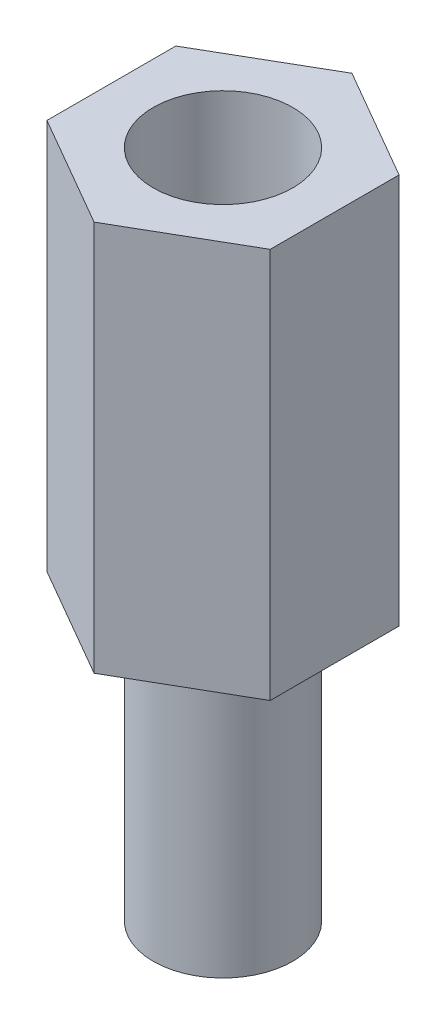
ISO-10303-21;
HEADER;
FILE_DESCRIPTION(('STEP AP214'),'2;1');
FILE_NAME('part.step','',(''),(''),'','','');
FILE_SCHEMA(('AUTOMOTIVE_DESIGN { 1 0 10303 214 1 1 1 1 }'));
ENDSEC;
DATA;
#1=APPLICATION_CONTEXT('core data for automotive mechanical design processes');
#2=APPLICATION_PROTOCOL_DEFINITION('international standard','automotive_design',2000,#1);
#3=PRODUCT_CONTEXT('',#1,'mechanical');
#4=PRODUCT('Part','Part','',(#3));
#5=PRODUCT_RELATED_PRODUCT_CATEGORY('part','',(#4));
#6=PRODUCT_DEFINITION_FORMATION('','',#4);
#7=PRODUCT_DEFINITION_CONTEXT('part definition',#1,'design');
#8=PRODUCT_DEFINITION('design','',#6,#7);
#9=PRODUCT_DEFINITION_SHAPE('','',#8);
#10=(LENGTH_UNIT() NAMED_UNIT(*) SI_UNIT(.MILLI.,.METRE.));
#11=(NAMED_UNIT(*) PLANE_ANGLE_UNIT() SI_UNIT($,.RADIAN.));
#12=(NAMED_UNIT(*) SI_UNIT($,.STERADIAN.) SOLID_ANGLE_UNIT());
#13=UNCERTAINTY_MEASURE_WITH_UNIT(LENGTH_MEASURE(1.E-05),#10,'distance_accuracy_value','');
#14=(GEOMETRIC_REPRESENTATION_CONTEXT(3) GLOBAL_UNCERTAINTY_ASSIGNED_CONTEXT((#13)) GLOBAL_UNIT_ASSIGNED_CONTEXT((#10,
#11,#12)) REPRESENTATION_CONTEXT('',''));
#15=CARTESIAN_POINT('',(0.,0.,0.));
#16=DIRECTION('',(0.,0.,1.));
#17=DIRECTION('',(1.,0.,0.));
#18=AXIS2_PLACEMENT_3D('',#15,#16,#17);
#19=CARTESIAN_POINT('',(-3.99999999999999,14.,2.30940107675852));
#20=DIRECTION('',(0.499999999999995,0.,-0.866025403784441));
#21=DIRECTION('',(-0.866025403784442,0.,-0.499999999999995));
#22=AXIS2_PLACEMENT_3D('',#19,#20,#21);
#23=PLANE('',#22);
#24=DIRECTION('',(0.866025403784441,0.,0.499999999999995));
#25=VECTOR('',#24,1.);
#26=CARTESIAN_POINT('',(-3.99999999999999,0.,2.30940107675852));
#27=LINE('',#26,#25);
#28=CARTESIAN_POINT('',(-3.99999999999999,0.,2.30940107675852));
#29=VERTEX_POINT('',#28);
#30=CARTESIAN_POINT('',(0.,0.,4.61880215351701));
#31=VERTEX_POINT('',#30);
#32=EDGE_CURVE('E119',#29,#31,#27,.T.);
#33=ORIENTED_EDGE('',*,*,#32,.T.);
#34=DIRECTION('',(0.,-1.,0.));
#35=VECTOR('',#34,1.);
#36=CARTESIAN_POINT('',(0.,14.,4.61880215351701));
#37=LINE('',#36,#35);
#38=CARTESIAN_POINT('',(0.,14.,4.61880215351701));
#39=VERTEX_POINT('',#38);
#40=EDGE_CURVE('E11',#39,#31,#37,.T.);
#41=ORIENTED_EDGE('',*,*,#40,.F.);
#42=DIRECTION('',(0.866025403784441,0.,0.499999999999995));
#43=VECTOR('',#42,1.);
#44=CARTESIAN_POINT('',(-3.99999999999999,14.,2.30940107675852));
#45=LINE('',#44,#43);
#46=CARTESIAN_POINT('',(-3.99999999999999,14.,2.30940107675852));
#47=VERTEX_POINT('',#46);
#48=EDGE_CURVE('E130',#47,#39,#45,.T.);
#49=ORIENTED_EDGE('',*,*,#48,.F.);
#50=DIRECTION('',(0.,-1.,0.));
#51=VECTOR('',#50,1.);
#52=CARTESIAN_POINT('',(-3.99999999999999,14.,2.30940107675852));
#53=LINE('',#52,#51);
#54=EDGE_CURVE('E115',#47,#29,#53,.T.);
#55=ORIENTED_EDGE('',*,*,#54,.T.);
#56=EDGE_LOOP('',(#33,#41,#49,#55));
#57=FACE_BOUND('',#56,.T.);
#58=ADVANCED_FACE('F35',(#57),#23,.F.);
#59=CARTESIAN_POINT('',(0.,14.,4.61880215351701));
#60=DIRECTION('',(-0.500000000000007,0.,-0.866025403784434));
#61=DIRECTION('',(-0.866025403784435,0.,0.500000000000007));
#62=AXIS2_PLACEMENT_3D('',#59,#60,#61);
#63=PLANE('',#62);
#64=DIRECTION('',(0.866025403784434,0.,-0.500000000000007));
#65=VECTOR('',#64,1.);
#66=CARTESIAN_POINT('',(0.,0.,4.61880215351701));
#67=LINE('',#66,#65);
#68=CARTESIAN_POINT('',(4.00000000000002,0.,2.30940107675847));
#69=VERTEX_POINT('',#68);
#70=EDGE_CURVE('E122',#31,#69,#67,.T.);
#71=ORIENTED_EDGE('',*,*,#70,.T.);
#72=DIRECTION('',(0.,-1.,0.));
#73=VECTOR('',#72,1.);
#74=CARTESIAN_POINT('',(4.00000000000002,14.,2.30940107675847));
#75=LINE('',#74,#73);
#76=CARTESIAN_POINT('',(4.00000000000002,14.,2.30940107675847));
#77=VERTEX_POINT('',#76);
#78=EDGE_CURVE('E43',#77,#69,#75,.T.);
#79=ORIENTED_EDGE('',*,*,#78,.F.);
#80=DIRECTION('',(0.866025403784434,0.,-0.500000000000007));
#81=VECTOR('',#80,1.);
#82=CARTESIAN_POINT('',(0.,14.,4.61880215351701));
#83=LINE('',#82,#81);
#84=EDGE_CURVE('E88',#39,#77,#83,.T.);
#85=ORIENTED_EDGE('',*,*,#84,.F.);
#86=ORIENTED_EDGE('',*,*,#40,.T.);
#87=EDGE_LOOP('',(#71,#79,#85,#86));
#88=FACE_BOUND('',#87,.T.);
#89=ADVANCED_FACE('F155',(#88),#63,.F.);
#90=CARTESIAN_POINT('',(4.00000000000002,14.,2.30940107675847));
#91=DIRECTION('',(-1.,0.,0.));
#92=DIRECTION('',(0.,0.,1.));
#93=AXIS2_PLACEMENT_3D('',#90,#91,#92);
#94=PLANE('',#93);
#95=DIRECTION('',(0.,0.,-1.));
#96=VECTOR('',#95,1.);
#97=CARTESIAN_POINT('',(4.00000000000002,0.,2.30940107675847));
#98=LINE('',#97,#96);
#99=CARTESIAN_POINT('',(3.99999999999998,0.,-2.30940107675855));
#100=VERTEX_POINT('',#99);
#101=EDGE_CURVE('E125',#69,#100,#98,.T.);
#102=ORIENTED_EDGE('',*,*,#101,.T.);
#103=DIRECTION('',(0.,-1.,0.));
#104=VECTOR('',#103,1.);
#105=CARTESIAN_POINT('',(3.99999999999998,14.,-2.30940107675855));
#106=LINE('',#105,#104);
#107=CARTESIAN_POINT('',(3.99999999999998,14.,-2.30940107675855));
#108=VERTEX_POINT('',#107);
#109=EDGE_CURVE('E110',#108,#100,#106,.T.);
#110=ORIENTED_EDGE('',*,*,#109,.F.);
#111=DIRECTION('',(0.,0.,-1.));
#112=VECTOR('',#111,1.);
#113=CARTESIAN_POINT('',(4.00000000000002,14.,2.30940107675847));
#114=LINE('',#113,#112);
#115=EDGE_CURVE('E101',#77,#108,#114,.T.);
#116=ORIENTED_EDGE('',*,*,#115,.F.);
#117=ORIENTED_EDGE('',*,*,#78,.T.);
#118=EDGE_LOOP('',(#102,#110,#116,#117));
#119=FACE_BOUND('',#118,.T.);
#120=ADVANCED_FACE('F136',(#119),#94,.F.);
#121=CARTESIAN_POINT('',(3.99999999999998,14.,-2.30940107675855));
#122=DIRECTION('',(-0.499999999999995,0.,0.866025403784442));
#123=DIRECTION('',(0.866025403784442,0.,0.499999999999995));
#124=AXIS2_PLACEMENT_3D('',#121,#122,#123);
#125=PLANE('',#124);
#126=DIRECTION('',(-0.866025403784442,0.,-0.499999999999995));
#127=VECTOR('',#126,1.);
#128=CARTESIAN_POINT('',(3.99999999999998,0.,-2.30940107675855));
#129=LINE('',#128,#127);
#130=CARTESIAN_POINT('',(0.,0.,-4.61880215351701));
#131=VERTEX_POINT('',#130);
#132=EDGE_CURVE('E109',#100,#131,#129,.T.);
#133=ORIENTED_EDGE('',*,*,#132,.T.);
#134=DIRECTION('',(0.,-1.,0.));
#135=VECTOR('',#134,1.);
#136=CARTESIAN_POINT('',(0.,14.,-4.61880215351701));
#137=LINE('',#136,#135);
#138=CARTESIAN_POINT('',(0.,14.,-4.61880215351701));
#139=VERTEX_POINT('',#138);
#140=EDGE_CURVE('E106',#139,#131,#137,.T.);
#141=ORIENTED_EDGE('',*,*,#140,.F.);
#142=DIRECTION('',(-0.866025403784442,0.,-0.499999999999995));
#143=VECTOR('',#142,1.);
#144=CARTESIAN_POINT('',(3.99999999999998,14.,-2.30940107675855));
#145=LINE('',#144,#143);
#146=EDGE_CURVE('E95',#108,#139,#145,.T.);
#147=ORIENTED_EDGE('',*,*,#146,.F.);
#148=ORIENTED_EDGE('',*,*,#109,.T.);
#149=EDGE_LOOP('',(#133,#141,#147,#148));
#150=FACE_BOUND('',#149,.T.);
#151=ADVANCED_FACE('F107',(#150),#125,.F.);
#152=CARTESIAN_POINT('',(0.,14.,-4.61880215351701));
#153=DIRECTION('',(0.500000000000001,0.,0.866025403784438));
#154=DIRECTION('',(0.866025403784438,0.,-0.500000000000001));
#155=AXIS2_PLACEMENT_3D('',#152,#153,#154);
#156=PLANE('',#155);
#157=DIRECTION('',(-0.866025403784438,0.,0.500000000000001));
#158=VECTOR('',#157,1.);
#159=CARTESIAN_POINT('',(0.,0.,-4.61880215351701));
#160=LINE('',#159,#158);
#161=CARTESIAN_POINT('',(-4.00000000000001,0.,-2.3094010767585));
#162=VERTEX_POINT('',#161);
#163=EDGE_CURVE('E74',#131,#162,#160,.T.);
#164=ORIENTED_EDGE('',*,*,#163,.T.);
#165=DIRECTION('',(0.,-1.,0.));
#166=VECTOR('',#165,1.);
#167=CARTESIAN_POINT('',(-4.00000000000001,14.,-2.3094010767585));
#168=LINE('',#167,#166);
#169=CARTESIAN_POINT('',(-4.00000000000001,14.,-2.3094010767585));
#170=VERTEX_POINT('',#169);
#171=EDGE_CURVE('E111',#170,#162,#168,.T.);
#172=ORIENTED_EDGE('',*,*,#171,.F.);
#173=DIRECTION('',(-0.866025403784438,0.,0.500000000000001));
#174=VECTOR('',#173,1.);
#175=CARTESIAN_POINT('',(0.,14.,-4.61880215351701));
#176=LINE('',#175,#174);
#177=EDGE_CURVE('E99',#139,#170,#176,.T.);
#178=ORIENTED_EDGE('',*,*,#177,.F.);
#179=ORIENTED_EDGE('',*,*,#140,.T.);
#180=EDGE_LOOP('',(#164,#172,#178,#179));
#181=FACE_BOUND('',#180,.T.);
#182=ADVANCED_FACE('F113',(#181),#156,.F.);
#183=CARTESIAN_POINT('',(-4.00000000000001,14.,-2.3094010767585));
#184=DIRECTION('',(1.,0.,0.));
#185=DIRECTION('',(0.,0.,-1.));
#186=AXIS2_PLACEMENT_3D('',#183,#184,#185);
#187=PLANE('',#186);
#188=DIRECTION('',(0.,0.,1.));
#189=VECTOR('',#188,1.);
#190=CARTESIAN_POINT('',(-4.00000000000001,0.,-2.3094010767585));
#191=LINE('',#190,#189);
#192=EDGE_CURVE('E80',#162,#29,#191,.T.);
#193=ORIENTED_EDGE('',*,*,#192,.T.);
#194=ORIENTED_EDGE('',*,*,#54,.F.);
#195=DIRECTION('',(0.,0.,1.));
#196=VECTOR('',#195,1.);
#197=CARTESIAN_POINT('',(-4.00000000000001,14.,-2.3094010767585));
#198=LINE('',#197,#196);
#199=EDGE_CURVE('E51',#170,#47,#198,.T.);
#200=ORIENTED_EDGE('',*,*,#199,.F.);
#201=ORIENTED_EDGE('',*,*,#171,.T.);
#202=EDGE_LOOP('',(#193,#194,#200,#201));
#203=FACE_BOUND('',#202,.T.);
#204=ADVANCED_FACE('F143',(#203),#187,.F.);
#205=CARTESIAN_POINT('',(0.,14.,0.));
#206=DIRECTION('',(0.,1.,0.));
#207=DIRECTION('',(0.,0.,1.));
#208=AXIS2_PLACEMENT_3D('',#205,#206,#207);
#209=PLANE('',#208);
#210=CARTESIAN_POINT('',(0.,14.,0.));
#211=DIRECTION('',(0.,1.,0.));
#212=DIRECTION('',(0.,0.,1.));
#213=AXIS2_PLACEMENT_3D('',#210,#211,#212);
#214=CIRCLE('',#213,2.5);
#215=CARTESIAN_POINT('',(0.,14.,2.5));
#216=VERTEX_POINT('',#215);
#217=EDGE_CURVE('E239',#216,#216,#214,.T.);
#218=ORIENTED_EDGE('',*,*,#217,.F.);
#219=EDGE_LOOP('',(#218));
#220=FACE_BOUND('',#219,.T.);
#221=ORIENTED_EDGE('',*,*,#48,.T.);
#222=ORIENTED_EDGE('',*,*,#84,.T.);
#223=ORIENTED_EDGE('',*,*,#115,.T.);
#224=ORIENTED_EDGE('',*,*,#146,.T.);
#225=ORIENTED_EDGE('',*,*,#177,.T.);
#226=ORIENTED_EDGE('',*,*,#199,.T.);
#227=EDGE_LOOP('',(#221,#222,#223,#224,#225,#226));
#228=FACE_BOUND('',#227,.T.);
#229=ADVANCED_FACE('F97',(#220,#228),#209,.T.);
#230=CARTESIAN_POINT('',(0.,0.,0.));
#231=DIRECTION('',(0.,1.,0.));
#232=DIRECTION('',(0.,0.,1.));
#233=AXIS2_PLACEMENT_3D('',#230,#231,#232);
#234=PLANE('',#233);
#235=CARTESIAN_POINT('',(0.,0.,0.));
#236=DIRECTION('',(0.,1.,0.));
#237=DIRECTION('',(0.,0.,1.));
#238=AXIS2_PLACEMENT_3D('',#235,#236,#237);
#239=CIRCLE('',#238,2.5);
#240=CARTESIAN_POINT('',(0.,0.,2.5));
#241=VERTEX_POINT('',#240);
#242=EDGE_CURVE('E238',#241,#241,#239,.T.);
#243=ORIENTED_EDGE('',*,*,#242,.T.);
#244=EDGE_LOOP('',(#243));
#245=FACE_BOUND('',#244,.T.);
#246=ORIENTED_EDGE('',*,*,#32,.F.);
#247=ORIENTED_EDGE('',*,*,#192,.F.);
#248=ORIENTED_EDGE('',*,*,#163,.F.);
#249=ORIENTED_EDGE('',*,*,#132,.F.);
#250=ORIENTED_EDGE('',*,*,#101,.F.);
#251=ORIENTED_EDGE('',*,*,#70,.F.);
#252=EDGE_LOOP('',(#246,#247,#248,#249,#250,#251));
#253=FACE_BOUND('',#252,.T.);
#254=ADVANCED_FACE('F139',(#245,#253),#234,.F.);
#255=CARTESIAN_POINT('',(0.,-10.,0.));
#256=DIRECTION('',(0.,1.,0.));
#257=DIRECTION('',(0.,0.,1.));
#258=AXIS2_PLACEMENT_3D('',#255,#256,#257);
#259=CYLINDRICAL_SURFACE('',#258,2.5);
#260=CARTESIAN_POINT('',(0.,-10.,0.));
#261=DIRECTION('',(0.,1.,0.));
#262=DIRECTION('',(0.,0.,1.));
#263=AXIS2_PLACEMENT_3D('',#260,#261,#262);
#264=CIRCLE('',#263,2.5);
#265=CARTESIAN_POINT('',(0.,-10.,2.5));
#266=VERTEX_POINT('',#265);
#267=EDGE_CURVE('E123',#266,#266,#264,.T.);
#268=ORIENTED_EDGE('',*,*,#267,.T.);
#269=EDGE_LOOP('',(#268));
#270=FACE_BOUND('',#269,.T.);
#271=ORIENTED_EDGE('',*,*,#242,.F.);
#272=EDGE_LOOP('',(#271));
#273=FACE_BOUND('',#272,.T.);
#274=ADVANCED_FACE('F187',(#270,#273),#259,.T.);
#275=CARTESIAN_POINT('',(0.,-10.,0.));
#276=DIRECTION('',(0.,1.,0.));
#277=DIRECTION('',(0.,0.,1.));
#278=AXIS2_PLACEMENT_3D('',#275,#276,#277);
#279=PLANE('',#278);
#280=ORIENTED_EDGE('',*,*,#267,.F.);
#281=EDGE_LOOP('',(#280));
#282=FACE_BOUND('',#281,.T.);
#283=ADVANCED_FACE('F196',(#282),#279,.F.);
#284=CARTESIAN_POINT('',(0.,8.,0.));
#285=DIRECTION('',(0.,1.,0.));
#286=DIRECTION('',(0.,0.,1.));
#287=AXIS2_PLACEMENT_3D('',#284,#285,#286);
#288=CYLINDRICAL_SURFACE('',#287,2.5);
#289=CARTESIAN_POINT('',(0.,8.,0.));
#290=DIRECTION('',(0.,1.,0.));
#291=DIRECTION('',(0.,0.,1.));
#292=AXIS2_PLACEMENT_3D('',#289,#290,#291);
#293=CIRCLE('',#292,2.5);
#294=CARTESIAN_POINT('',(0.,8.,2.5));
#295=VERTEX_POINT('',#294);
#296=EDGE_CURVE('E237',#295,#295,#293,.T.);
#297=ORIENTED_EDGE('',*,*,#296,.F.);
#298=EDGE_LOOP('',(#297));
#299=FACE_BOUND('',#298,.T.);
#300=ORIENTED_EDGE('',*,*,#217,.T.);
#301=EDGE_LOOP('',(#300));
#302=FACE_BOUND('',#301,.T.);
#303=ADVANCED_FACE('F206',(#299,#302),#288,.F.);
#304=CARTESIAN_POINT('',(0.,8.,0.));
#305=DIRECTION('',(0.,1.,0.));
#306=DIRECTION('',(0.,0.,1.));
#307=AXIS2_PLACEMENT_3D('',#304,#305,#306);
#308=PLANE('',#307);
#309=ORIENTED_EDGE('',*,*,#296,.T.);
#310=EDGE_LOOP('',(#309));
#311=FACE_BOUND('',#310,.T.);
#312=ADVANCED_FACE('F221',(#311),#308,.T.);
#313=CLOSED_SHELL('',(#58,#89,#120,#151,#182,#204,#229,#254,#274,#283,#303,#312));
#314=MANIFOLD_SOLID_BREP('B2',#313);
#315=ADVANCED_BREP_SHAPE_REPRESENTATION('',(#18,#314),#14);
#316=SHAPE_DEFINITION_REPRESENTATION(#9,#315);
ENDSEC;
END-ISO-10303-21;
